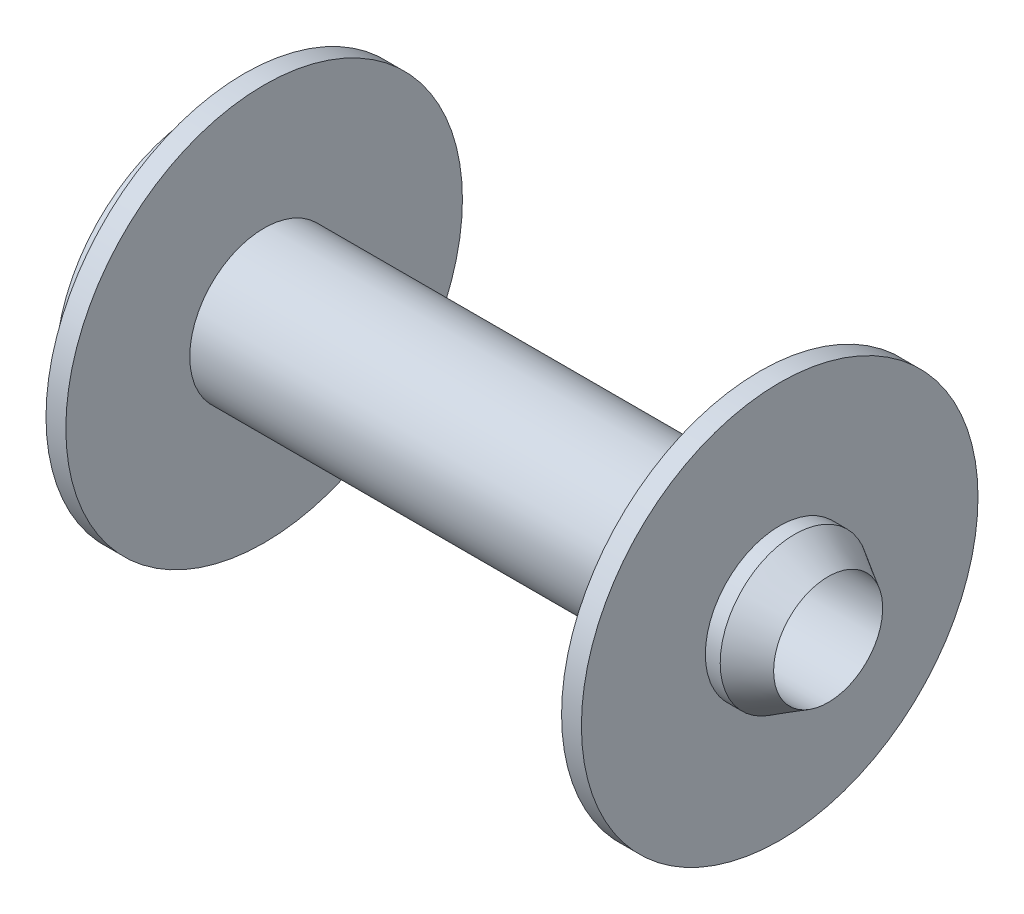
ISO-10303-21;
HEADER;
FILE_DESCRIPTION(('STEP AP214'),'2;1');
FILE_NAME('part.step','',(''),(''),'','','');
FILE_SCHEMA(('AUTOMOTIVE_DESIGN { 1 0 10303 214 1 1 1 1 }'));
ENDSEC;
DATA;
#1=APPLICATION_CONTEXT('core data for automotive mechanical design processes');
#2=APPLICATION_PROTOCOL_DEFINITION('international standard','automotive_design',2000,#1);
#3=PRODUCT_CONTEXT('',#1,'mechanical');
#4=PRODUCT('Part','Part','',(#3));
#5=PRODUCT_RELATED_PRODUCT_CATEGORY('part','',(#4));
#6=PRODUCT_DEFINITION_FORMATION('','',#4);
#7=PRODUCT_DEFINITION_CONTEXT('part definition',#1,'design');
#8=PRODUCT_DEFINITION('design','',#6,#7);
#9=PRODUCT_DEFINITION_SHAPE('','',#8);
#10=(LENGTH_UNIT() NAMED_UNIT(*) SI_UNIT(.MILLI.,.METRE.));
#11=(NAMED_UNIT(*) PLANE_ANGLE_UNIT() SI_UNIT($,.RADIAN.));
#12=(NAMED_UNIT(*) SI_UNIT($,.STERADIAN.) SOLID_ANGLE_UNIT());
#13=UNCERTAINTY_MEASURE_WITH_UNIT(LENGTH_MEASURE(1.E-05),#10,'distance_accuracy_value','');
#14=(GEOMETRIC_REPRESENTATION_CONTEXT(3) GLOBAL_UNCERTAINTY_ASSIGNED_CONTEXT((#13)) GLOBAL_UNIT_ASSIGNED_CONTEXT((#10,
#11,#12)) REPRESENTATION_CONTEXT('',''));
#15=CARTESIAN_POINT('',(0.,0.,0.));
#16=DIRECTION('',(0.,0.,1.));
#17=DIRECTION('',(1.,0.,0.));
#18=AXIS2_PLACEMENT_3D('',#15,#16,#17);
#19=CARTESIAN_POINT('',(-22.229254667411,0.,0.));
#20=DIRECTION('',(-1.,0.,0.));
#21=DIRECTION('',(0.,0.,1.));
#22=AXIS2_PLACEMENT_3D('',#19,#20,#21);
#23=CYLINDRICAL_SURFACE('',#22,11.);
#24=CARTESIAN_POINT('',(63.77258186821,0.,0.));
#25=DIRECTION('',(-1.,0.,0.));
#26=DIRECTION('',(0.,0.,1.));
#27=AXIS2_PLACEMENT_3D('',#24,#25,#26);
#28=CIRCLE('',#27,11.);
#29=CARTESIAN_POINT('',(63.77258186821,0.,11.));
#30=VERTEX_POINT('',#29);
#31=EDGE_CURVE('E10',#30,#30,#28,.T.);
#32=ORIENTED_EDGE('',*,*,#31,.F.);
#33=EDGE_LOOP('',(#32));
#34=FACE_BOUND('',#33,.T.);
#35=CARTESIAN_POINT('',(-65.1078678050982,0.,0.));
#36=DIRECTION('',(-1.,0.,0.));
#37=DIRECTION('',(0.,0.,1.));
#38=AXIS2_PLACEMENT_3D('',#35,#36,#37);
#39=CIRCLE('',#38,11.);
#40=CARTESIAN_POINT('',(-65.1078678050982,0.,11.));
#41=VERTEX_POINT('',#40);
#42=EDGE_CURVE('E106',#41,#41,#39,.T.);
#43=ORIENTED_EDGE('',*,*,#42,.T.);
#44=EDGE_LOOP('',(#43));
#45=FACE_BOUND('',#44,.T.);
#46=ADVANCED_FACE('F43',(#34,#45),#23,.F.);
#47=CARTESIAN_POINT('',(63.77258186821,0.,0.));
#48=DIRECTION('',(-1.,0.,0.));
#49=DIRECTION('',(0.,0.,1.));
#50=AXIS2_PLACEMENT_3D('',#47,#48,#49);
#51=CONICAL_SURFACE('',#50,11.,0.533491450448314);
#52=CARTESIAN_POINT('',(57.,0.,0.));
#53=DIRECTION('',(-1.,0.,0.));
#54=DIRECTION('',(0.,0.,1.));
#55=AXIS2_PLACEMENT_3D('',#52,#53,#54);
#56=CIRCLE('',#55,15.);
#57=CARTESIAN_POINT('',(57.,0.,15.));
#58=VERTEX_POINT('',#57);
#59=EDGE_CURVE('E50',#58,#58,#56,.T.);
#60=ORIENTED_EDGE('',*,*,#59,.F.);
#61=EDGE_LOOP('',(#60));
#62=FACE_BOUND('',#61,.T.);
#63=ORIENTED_EDGE('',*,*,#31,.T.);
#64=EDGE_LOOP('',(#63));
#65=FACE_BOUND('',#64,.T.);
#66=ADVANCED_FACE('F186',(#62,#65),#51,.T.);
#67=CARTESIAN_POINT('',(-22.229254667411,0.,0.));
#68=DIRECTION('',(-1.,0.,0.));
#69=DIRECTION('',(0.,0.,1.));
#70=AXIS2_PLACEMENT_3D('',#67,#68,#69);
#71=CYLINDRICAL_SURFACE('',#70,15.);
#72=CARTESIAN_POINT('',(54.,0.,0.));
#73=DIRECTION('',(-1.,0.,0.));
#74=DIRECTION('',(0.,0.,1.));
#75=AXIS2_PLACEMENT_3D('',#72,#73,#74);
#76=CIRCLE('',#75,15.);
#77=CARTESIAN_POINT('',(54.,0.,15.));
#78=VERTEX_POINT('',#77);
#79=EDGE_CURVE('E55',#78,#78,#76,.T.);
#80=ORIENTED_EDGE('',*,*,#79,.F.);
#81=EDGE_LOOP('',(#80));
#82=FACE_BOUND('',#81,.T.);
#83=ORIENTED_EDGE('',*,*,#59,.T.);
#84=EDGE_LOOP('',(#83));
#85=FACE_BOUND('',#84,.T.);
#86=ADVANCED_FACE('F181',(#82,#85),#71,.T.);
#87=CARTESIAN_POINT('',(54.,15.,0.));
#88=DIRECTION('',(-1.,0.,0.));
#89=DIRECTION('',(0.,0.,1.));
#90=AXIS2_PLACEMENT_3D('',#87,#88,#89);
#91=PLANE('',#90);
#92=CARTESIAN_POINT('',(54.,0.,0.));
#93=DIRECTION('',(-1.,0.,0.));
#94=DIRECTION('',(0.,0.,1.));
#95=AXIS2_PLACEMENT_3D('',#92,#93,#94);
#96=CIRCLE('',#95,40.);
#97=CARTESIAN_POINT('',(54.,0.,40.));
#98=VERTEX_POINT('',#97);
#99=EDGE_CURVE('E60',#98,#98,#96,.T.);
#100=ORIENTED_EDGE('',*,*,#99,.F.);
#101=EDGE_LOOP('',(#100));
#102=FACE_BOUND('',#101,.T.);
#103=ORIENTED_EDGE('',*,*,#79,.T.);
#104=EDGE_LOOP('',(#103));
#105=FACE_BOUND('',#104,.T.);
#106=ADVANCED_FACE('F175',(#102,#105),#91,.F.);
#107=CARTESIAN_POINT('',(-22.229254667411,0.,0.));
#108=DIRECTION('',(-1.,0.,0.));
#109=DIRECTION('',(0.,0.,1.));
#110=AXIS2_PLACEMENT_3D('',#107,#108,#109);
#111=CYLINDRICAL_SURFACE('',#110,40.);
#112=CARTESIAN_POINT('',(50.,0.,0.));
#113=DIRECTION('',(-1.,0.,0.));
#114=DIRECTION('',(0.,0.,1.));
#115=AXIS2_PLACEMENT_3D('',#112,#113,#114);
#116=CIRCLE('',#115,40.);
#117=CARTESIAN_POINT('',(50.,0.,40.));
#118=VERTEX_POINT('',#117);
#119=EDGE_CURVE('E66',#118,#118,#116,.T.);
#120=ORIENTED_EDGE('',*,*,#119,.F.);
#121=EDGE_LOOP('',(#120));
#122=FACE_BOUND('',#121,.T.);
#123=ORIENTED_EDGE('',*,*,#99,.T.);
#124=EDGE_LOOP('',(#123));
#125=FACE_BOUND('',#124,.T.);
#126=ADVANCED_FACE('F169',(#122,#125),#111,.T.);
#127=CARTESIAN_POINT('',(50.,40.,0.));
#128=DIRECTION('',(1.,0.,0.));
#129=DIRECTION('',(0.,0.,-1.));
#130=AXIS2_PLACEMENT_3D('',#127,#128,#129);
#131=PLANE('',#130);
#132=CARTESIAN_POINT('',(50.,0.,0.));
#133=DIRECTION('',(-1.,0.,0.));
#134=DIRECTION('',(0.,0.,1.));
#135=AXIS2_PLACEMENT_3D('',#132,#133,#134);
#136=CIRCLE('',#135,15.);
#137=CARTESIAN_POINT('',(50.,0.,15.));
#138=VERTEX_POINT('',#137);
#139=EDGE_CURVE('E70',#138,#138,#136,.T.);
#140=ORIENTED_EDGE('',*,*,#139,.F.);
#141=EDGE_LOOP('',(#140));
#142=FACE_BOUND('',#141,.T.);
#143=ORIENTED_EDGE('',*,*,#119,.T.);
#144=EDGE_LOOP('',(#143));
#145=FACE_BOUND('',#144,.T.);
#146=ADVANCED_FACE('F163',(#142,#145),#131,.F.);
#147=CARTESIAN_POINT('',(-22.229254667411,0.,0.));
#148=DIRECTION('',(-1.,0.,0.));
#149=DIRECTION('',(0.,0.,1.));
#150=AXIS2_PLACEMENT_3D('',#147,#148,#149);
#151=CYLINDRICAL_SURFACE('',#150,15.);
#152=CARTESIAN_POINT('',(-50.,0.,0.));
#153=DIRECTION('',(-1.,0.,0.));
#154=DIRECTION('',(0.,0.,1.));
#155=AXIS2_PLACEMENT_3D('',#152,#153,#154);
#156=CIRCLE('',#155,15.);
#157=CARTESIAN_POINT('',(-50.,0.,15.));
#158=VERTEX_POINT('',#157);
#159=EDGE_CURVE('E74',#158,#158,#156,.T.);
#160=ORIENTED_EDGE('',*,*,#159,.F.);
#161=EDGE_LOOP('',(#160));
#162=FACE_BOUND('',#161,.T.);
#163=ORIENTED_EDGE('',*,*,#139,.T.);
#164=EDGE_LOOP('',(#163));
#165=FACE_BOUND('',#164,.T.);
#166=ADVANCED_FACE('F157',(#162,#165),#151,.T.);
#167=CARTESIAN_POINT('',(-50.,15.,0.));
#168=DIRECTION('',(-1.,0.,0.));
#169=DIRECTION('',(0.,0.,1.));
#170=AXIS2_PLACEMENT_3D('',#167,#168,#169);
#171=PLANE('',#170);
#172=CARTESIAN_POINT('',(-50.,0.,0.));
#173=DIRECTION('',(-1.,0.,0.));
#174=DIRECTION('',(0.,0.,1.));
#175=AXIS2_PLACEMENT_3D('',#172,#173,#174);
#176=CIRCLE('',#175,40.);
#177=CARTESIAN_POINT('',(-50.,0.,40.));
#178=VERTEX_POINT('',#177);
#179=EDGE_CURVE('E78',#178,#178,#176,.T.);
#180=ORIENTED_EDGE('',*,*,#179,.F.);
#181=EDGE_LOOP('',(#180));
#182=FACE_BOUND('',#181,.T.);
#183=ORIENTED_EDGE('',*,*,#159,.T.);
#184=EDGE_LOOP('',(#183));
#185=FACE_BOUND('',#184,.T.);
#186=ADVANCED_FACE('F151',(#182,#185),#171,.F.);
#187=CARTESIAN_POINT('',(-22.229254667411,0.,0.));
#188=DIRECTION('',(-1.,0.,0.));
#189=DIRECTION('',(0.,0.,1.));
#190=AXIS2_PLACEMENT_3D('',#187,#188,#189);
#191=CYLINDRICAL_SURFACE('',#190,40.);
#192=CARTESIAN_POINT('',(-54.,0.,0.));
#193=DIRECTION('',(-1.,0.,0.));
#194=DIRECTION('',(0.,0.,1.));
#195=AXIS2_PLACEMENT_3D('',#192,#193,#194);
#196=CIRCLE('',#195,40.);
#197=CARTESIAN_POINT('',(-54.,0.,40.));
#198=VERTEX_POINT('',#197);
#199=EDGE_CURVE('E82',#198,#198,#196,.T.);
#200=ORIENTED_EDGE('',*,*,#199,.F.);
#201=EDGE_LOOP('',(#200));
#202=FACE_BOUND('',#201,.T.);
#203=ORIENTED_EDGE('',*,*,#179,.T.);
#204=EDGE_LOOP('',(#203));
#205=FACE_BOUND('',#204,.T.);
#206=ADVANCED_FACE('F145',(#202,#205),#191,.T.);
#207=CARTESIAN_POINT('',(-54.,40.,0.));
#208=DIRECTION('',(1.,0.,0.));
#209=DIRECTION('',(0.,0.,-1.));
#210=AXIS2_PLACEMENT_3D('',#207,#208,#209);
#211=PLANE('',#210);
#212=CARTESIAN_POINT('',(-54.,0.,0.));
#213=DIRECTION('',(-1.,0.,0.));
#214=DIRECTION('',(0.,0.,1.));
#215=AXIS2_PLACEMENT_3D('',#212,#213,#214);
#216=CIRCLE('',#215,15.);
#217=CARTESIAN_POINT('',(-54.,0.,15.));
#218=VERTEX_POINT('',#217);
#219=EDGE_CURVE('E86',#218,#218,#216,.T.);
#220=ORIENTED_EDGE('',*,*,#219,.F.);
#221=EDGE_LOOP('',(#220));
#222=FACE_BOUND('',#221,.T.);
#223=ORIENTED_EDGE('',*,*,#199,.T.);
#224=EDGE_LOOP('',(#223));
#225=FACE_BOUND('',#224,.T.);
#226=ADVANCED_FACE('F139',(#222,#225),#211,.F.);
#227=CARTESIAN_POINT('',(-22.229254667411,0.,0.));
#228=DIRECTION('',(-1.,0.,0.));
#229=DIRECTION('',(0.,0.,1.));
#230=AXIS2_PLACEMENT_3D('',#227,#228,#229);
#231=CYLINDRICAL_SURFACE('',#230,15.);
#232=CARTESIAN_POINT('',(-57.,0.,0.));
#233=DIRECTION('',(-1.,0.,0.));
#234=DIRECTION('',(0.,0.,1.));
#235=AXIS2_PLACEMENT_3D('',#232,#233,#234);
#236=CIRCLE('',#235,15.);
#237=CARTESIAN_POINT('',(-57.,0.,15.));
#238=VERTEX_POINT('',#237);
#239=EDGE_CURVE('E90',#238,#238,#236,.T.);
#240=ORIENTED_EDGE('',*,*,#239,.F.);
#241=EDGE_LOOP('',(#240));
#242=FACE_BOUND('',#241,.T.);
#243=ORIENTED_EDGE('',*,*,#219,.T.);
#244=EDGE_LOOP('',(#243));
#245=FACE_BOUND('',#244,.T.);
#246=ADVANCED_FACE('F133',(#242,#245),#231,.T.);
#247=CARTESIAN_POINT('',(-57.,15.,0.));
#248=DIRECTION('',(-1.,0.,0.));
#249=DIRECTION('',(0.,0.,1.));
#250=AXIS2_PLACEMENT_3D('',#247,#248,#249);
#251=PLANE('',#250);
#252=CARTESIAN_POINT('',(-57.,0.,0.));
#253=DIRECTION('',(-1.,0.,0.));
#254=DIRECTION('',(0.,0.,1.));
#255=AXIS2_PLACEMENT_3D('',#252,#253,#254);
#256=CIRCLE('',#255,30.);
#257=CARTESIAN_POINT('',(-57.,0.,30.));
#258=VERTEX_POINT('',#257);
#259=EDGE_CURVE('E94',#258,#258,#256,.T.);
#260=ORIENTED_EDGE('',*,*,#259,.F.);
#261=EDGE_LOOP('',(#260));
#262=FACE_BOUND('',#261,.T.);
#263=ORIENTED_EDGE('',*,*,#239,.T.);
#264=EDGE_LOOP('',(#263));
#265=FACE_BOUND('',#264,.T.);
#266=ADVANCED_FACE('F127',(#262,#265),#251,.F.);
#267=CARTESIAN_POINT('',(-22.229254667411,0.,0.));
#268=DIRECTION('',(-1.,0.,0.));
#269=DIRECTION('',(0.,0.,1.));
#270=AXIS2_PLACEMENT_3D('',#267,#268,#269);
#271=CYLINDRICAL_SURFACE('',#270,30.);
#272=CARTESIAN_POINT('',(-62.,0.,0.));
#273=DIRECTION('',(-1.,0.,0.));
#274=DIRECTION('',(0.,0.,1.));
#275=AXIS2_PLACEMENT_3D('',#272,#273,#274);
#276=CIRCLE('',#275,30.);
#277=CARTESIAN_POINT('',(-62.,0.,30.));
#278=VERTEX_POINT('',#277);
#279=EDGE_CURVE('E98',#278,#278,#276,.T.);
#280=ORIENTED_EDGE('',*,*,#279,.F.);
#281=EDGE_LOOP('',(#280));
#282=FACE_BOUND('',#281,.T.);
#283=ORIENTED_EDGE('',*,*,#259,.T.);
#284=EDGE_LOOP('',(#283));
#285=FACE_BOUND('',#284,.T.);
#286=ADVANCED_FACE('F121',(#282,#285),#271,.T.);
#287=CARTESIAN_POINT('',(-62.,30.,0.));
#288=DIRECTION('',(1.,0.,0.));
#289=DIRECTION('',(0.,0.,-1.));
#290=AXIS2_PLACEMENT_3D('',#287,#288,#289);
#291=PLANE('',#290);
#292=CARTESIAN_POINT('',(-62.,0.,0.));
#293=DIRECTION('',(-1.,0.,0.));
#294=DIRECTION('',(0.,0.,1.));
#295=AXIS2_PLACEMENT_3D('',#292,#293,#294);
#296=CIRCLE('',#295,15.);
#297=CARTESIAN_POINT('',(-62.,0.,15.));
#298=VERTEX_POINT('',#297);
#299=EDGE_CURVE('E102',#298,#298,#296,.T.);
#300=ORIENTED_EDGE('',*,*,#299,.F.);
#301=EDGE_LOOP('',(#300));
#302=FACE_BOUND('',#301,.T.);
#303=ORIENTED_EDGE('',*,*,#279,.T.);
#304=EDGE_LOOP('',(#303));
#305=FACE_BOUND('',#304,.T.);
#306=ADVANCED_FACE('F115',(#302,#305),#291,.F.);
#307=CARTESIAN_POINT('',(-62.,0.,0.));
#308=DIRECTION('',(1.,0.,0.));
#309=DIRECTION('',(0.,0.,-1.));
#310=AXIS2_PLACEMENT_3D('',#307,#308,#309);
#311=CONICAL_SURFACE('',#310,15.,0.910258563777634);
#312=ORIENTED_EDGE('',*,*,#42,.F.);
#313=EDGE_LOOP('',(#312));
#314=FACE_BOUND('',#313,.T.);
#315=ORIENTED_EDGE('',*,*,#299,.T.);
#316=EDGE_LOOP('',(#315));
#317=FACE_BOUND('',#316,.T.);
#318=ADVANCED_FACE('F112',(#314,#317),#311,.T.);
#319=CLOSED_SHELL('',(#46,#66,#86,#106,#126,#146,#166,#186,#206,#226,#246,#266,#286,#306,#318));
#320=MANIFOLD_SOLID_BREP('B2',#319);
#321=ADVANCED_BREP_SHAPE_REPRESENTATION('',(#18,#320),#14);
#322=SHAPE_DEFINITION_REPRESENTATION(#9,#321);
ENDSEC;
END-ISO-10303-21;
